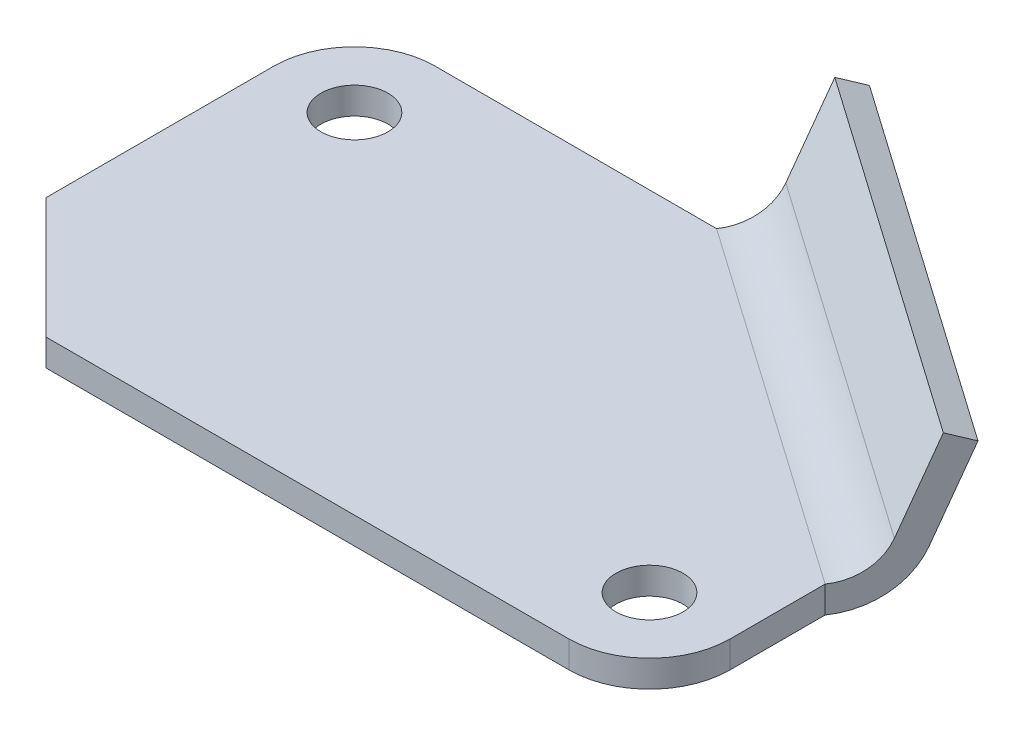
ISO-10303-21;
HEADER;
FILE_DESCRIPTION(('STEP AP214'),'2;1');
FILE_NAME('part.step','',(''),(''),'','','');
FILE_SCHEMA(('AUTOMOTIVE_DESIGN { 1 0 10303 214 1 1 1 1 }'));
ENDSEC;
DATA;
#1=APPLICATION_CONTEXT('core data for automotive mechanical design processes');
#2=APPLICATION_PROTOCOL_DEFINITION('international standard','automotive_design',2000,#1);
#3=PRODUCT_CONTEXT('',#1,'mechanical');
#4=PRODUCT('Part','Part','',(#3));
#5=PRODUCT_RELATED_PRODUCT_CATEGORY('part','',(#4));
#6=PRODUCT_DEFINITION_FORMATION('','',#4);
#7=PRODUCT_DEFINITION_CONTEXT('part definition',#1,'design');
#8=PRODUCT_DEFINITION('design','',#6,#7);
#9=PRODUCT_DEFINITION_SHAPE('','',#8);
#10=(LENGTH_UNIT() NAMED_UNIT(*) SI_UNIT(.MILLI.,.METRE.));
#11=(NAMED_UNIT(*) PLANE_ANGLE_UNIT() SI_UNIT($,.RADIAN.));
#12=(NAMED_UNIT(*) SI_UNIT($,.STERADIAN.) SOLID_ANGLE_UNIT());
#13=UNCERTAINTY_MEASURE_WITH_UNIT(LENGTH_MEASURE(1.E-05),#10,'distance_accuracy_value','');
#14=(GEOMETRIC_REPRESENTATION_CONTEXT(3) GLOBAL_UNCERTAINTY_ASSIGNED_CONTEXT((#13)) GLOBAL_UNIT_ASSIGNED_CONTEXT((#10,
#11,#12)) REPRESENTATION_CONTEXT('',''));
#15=CARTESIAN_POINT('',(0.,0.,0.));
#16=DIRECTION('',(0.,0.,1.));
#17=DIRECTION('',(1.,0.,0.));
#18=AXIS2_PLACEMENT_3D('',#15,#16,#17);
#19=CARTESIAN_POINT('',(12.,4.,-52.));
#20=DIRECTION('',(0.,-1.,0.));
#21=DIRECTION('',(0.,0.,-1.));
#22=AXIS2_PLACEMENT_3D('',#19,#20,#21);
#23=CYLINDRICAL_SURFACE('',#22,12.);
#24=CARTESIAN_POINT('',(12.,0.,-52.));
#25=DIRECTION('',(0.,1.,0.));
#26=DIRECTION('',(0.,0.,1.));
#27=AXIS2_PLACEMENT_3D('',#24,#25,#26);
#28=CIRCLE('',#27,12.);
#29=CARTESIAN_POINT('',(0.,0.,-51.9999999999999));
#30=VERTEX_POINT('',#29);
#31=CARTESIAN_POINT('',(12.0000000000001,0.,-64.));
#32=VERTEX_POINT('',#31);
#33=EDGE_CURVE('E144',#30,#32,#28,.F.);
#34=ORIENTED_EDGE('',*,*,#33,.F.);
#35=DIRECTION('',(0.,-1.,0.));
#36=VECTOR('',#35,1.);
#37=CARTESIAN_POINT('',(0.,4.,-51.9999999999999));
#38=LINE('',#37,#36);
#39=CARTESIAN_POINT('',(0.,4.,-51.9999999999999));
#40=VERTEX_POINT('',#39);
#41=EDGE_CURVE('E11',#40,#30,#38,.T.);
#42=ORIENTED_EDGE('',*,*,#41,.F.);
#43=CARTESIAN_POINT('',(12.,4.,-52.));
#44=DIRECTION('',(0.,1.,0.));
#45=DIRECTION('',(0.,0.,1.));
#46=AXIS2_PLACEMENT_3D('',#43,#44,#45);
#47=CIRCLE('',#46,12.);
#48=CARTESIAN_POINT('',(12.0000000000001,4.,-64.));
#49=VERTEX_POINT('',#48);
#50=EDGE_CURVE('E170',#40,#49,#47,.F.);
#51=ORIENTED_EDGE('',*,*,#50,.T.);
#52=DIRECTION('',(0.,-1.,0.));
#53=VECTOR('',#52,1.);
#54=CARTESIAN_POINT('',(12.0000000000001,4.,-64.));
#55=LINE('',#54,#53);
#56=EDGE_CURVE('E52',#49,#32,#55,.T.);
#57=ORIENTED_EDGE('',*,*,#56,.T.);
#58=EDGE_LOOP('',(#34,#42,#51,#57));
#59=FACE_BOUND('',#58,.T.);
#60=ADVANCED_FACE('F36',(#59),#23,.T.);
#61=CARTESIAN_POINT('',(0.,4.,0.));
#62=DIRECTION('',(-1.,0.,0.));
#63=DIRECTION('',(0.,0.,1.));
#64=AXIS2_PLACEMENT_3D('',#61,#62,#63);
#65=PLANE('',#64);
#66=DIRECTION('',(0.,0.,-1.));
#67=VECTOR('',#66,1.);
#68=CARTESIAN_POINT('',(0.,0.,0.));
#69=LINE('',#68,#67);
#70=CARTESIAN_POINT('',(0.,0.,-18.));
#71=VERTEX_POINT('',#70);
#72=EDGE_CURVE('E146',#71,#30,#69,.T.);
#73=ORIENTED_EDGE('',*,*,#72,.F.);
#74=DIRECTION('',(0.,-1.,0.));
#75=VECTOR('',#74,1.);
#76=CARTESIAN_POINT('',(0.,4.,-18.));
#77=LINE('',#76,#75);
#78=CARTESIAN_POINT('',(0.,4.,-18.));
#79=VERTEX_POINT('',#78);
#80=EDGE_CURVE('E44',#79,#71,#77,.T.);
#81=ORIENTED_EDGE('',*,*,#80,.F.);
#82=DIRECTION('',(0.,0.,-1.));
#83=VECTOR('',#82,1.);
#84=CARTESIAN_POINT('',(0.,4.,0.));
#85=LINE('',#84,#83);
#86=EDGE_CURVE('E187',#79,#40,#85,.T.);
#87=ORIENTED_EDGE('',*,*,#86,.T.);
#88=ORIENTED_EDGE('',*,*,#41,.T.);
#89=EDGE_LOOP('',(#73,#81,#87,#88));
#90=FACE_BOUND('',#89,.T.);
#91=ADVANCED_FACE('F186',(#90),#65,.T.);
#92=CARTESIAN_POINT('',(9.,4.,-9.));
#93=DIRECTION('',(0.707106781186547,0.,-0.707106781186548));
#94=DIRECTION('',(-0.707106781186548,0.,-0.707106781186547));
#95=AXIS2_PLACEMENT_3D('',#92,#93,#94);
#96=PLANE('',#95);
#97=DIRECTION('',(0.707106781186548,0.,0.707106781186547));
#98=VECTOR('',#97,1.);
#99=CARTESIAN_POINT('',(9.,0.,-9.));
#100=LINE('',#99,#98);
#101=CARTESIAN_POINT('',(18.,0.,0.));
#102=VERTEX_POINT('',#101);
#103=EDGE_CURVE('E150',#71,#102,#100,.T.);
#104=ORIENTED_EDGE('',*,*,#103,.T.);
#105=DIRECTION('',(0.,-1.,0.));
#106=VECTOR('',#105,1.);
#107=CARTESIAN_POINT('',(18.,4.,0.));
#108=LINE('',#107,#106);
#109=CARTESIAN_POINT('',(18.,4.,0.));
#110=VERTEX_POINT('',#109);
#111=EDGE_CURVE('E122',#110,#102,#108,.T.);
#112=ORIENTED_EDGE('',*,*,#111,.F.);
#113=DIRECTION('',(0.707106781186548,0.,0.707106781186547));
#114=VECTOR('',#113,1.);
#115=CARTESIAN_POINT('',(9.,4.,-9.));
#116=LINE('',#115,#114);
#117=EDGE_CURVE('E110',#79,#110,#116,.T.);
#118=ORIENTED_EDGE('',*,*,#117,.F.);
#119=ORIENTED_EDGE('',*,*,#80,.T.);
#120=EDGE_LOOP('',(#104,#112,#118,#119));
#121=FACE_BOUND('',#120,.T.);
#122=ADVANCED_FACE('F179',(#121),#96,.F.);
#123=CARTESIAN_POINT('',(0.,4.,0.));
#124=DIRECTION('',(0.,0.,-1.));
#125=DIRECTION('',(-1.,0.,0.));
#126=AXIS2_PLACEMENT_3D('',#123,#124,#125);
#127=PLANE('',#126);
#128=DIRECTION('',(1.,0.,0.));
#129=VECTOR('',#128,1.);
#130=CARTESIAN_POINT('',(0.,0.,0.));
#131=LINE('',#130,#129);
#132=CARTESIAN_POINT('',(95.9999999999999,0.,0.));
#133=VERTEX_POINT('',#132);
#134=EDGE_CURVE('E119',#102,#133,#131,.T.);
#135=ORIENTED_EDGE('',*,*,#134,.T.);
#136=DIRECTION('',(0.,-1.,0.));
#137=VECTOR('',#136,1.);
#138=CARTESIAN_POINT('',(95.9999999999999,4.,0.));
#139=LINE('',#138,#137);
#140=CARTESIAN_POINT('',(95.9999999999999,4.,0.));
#141=VERTEX_POINT('',#140);
#142=EDGE_CURVE('E116',#141,#133,#139,.T.);
#143=ORIENTED_EDGE('',*,*,#142,.F.);
#144=DIRECTION('',(1.,0.,0.));
#145=VECTOR('',#144,1.);
#146=CARTESIAN_POINT('',(0.,4.,0.));
#147=LINE('',#146,#145);
#148=EDGE_CURVE('E100',#110,#141,#147,.T.);
#149=ORIENTED_EDGE('',*,*,#148,.F.);
#150=ORIENTED_EDGE('',*,*,#111,.T.);
#151=EDGE_LOOP('',(#135,#143,#149,#150));
#152=FACE_BOUND('',#151,.T.);
#153=ADVANCED_FACE('F117',(#152),#127,.F.);
#154=CARTESIAN_POINT('',(96.,4.,-12.));
#155=DIRECTION('',(0.,-1.,0.));
#156=DIRECTION('',(0.,0.,-1.));
#157=AXIS2_PLACEMENT_3D('',#154,#155,#156);
#158=CYLINDRICAL_SURFACE('',#157,12.);
#159=CARTESIAN_POINT('',(96.,0.,-12.));
#160=DIRECTION('',(0.,1.,0.));
#161=DIRECTION('',(0.,0.,1.));
#162=AXIS2_PLACEMENT_3D('',#159,#160,#161);
#163=CIRCLE('',#162,12.);
#164=CARTESIAN_POINT('',(108.,0.,-12.0000000000001));
#165=VERTEX_POINT('',#164);
#166=EDGE_CURVE('E153',#133,#165,#163,.T.);
#167=ORIENTED_EDGE('',*,*,#166,.T.);
#168=DIRECTION('',(0.,-1.,0.));
#169=VECTOR('',#168,1.);
#170=CARTESIAN_POINT('',(108.,4.,-12.0000000000001));
#171=LINE('',#170,#169);
#172=CARTESIAN_POINT('',(108.,4.,-12.0000000000001));
#173=VERTEX_POINT('',#172);
#174=EDGE_CURVE('E123',#173,#165,#171,.T.);
#175=ORIENTED_EDGE('',*,*,#174,.F.);
#176=CARTESIAN_POINT('',(96.,4.,-12.));
#177=DIRECTION('',(0.,1.,0.));
#178=DIRECTION('',(0.,0.,1.));
#179=AXIS2_PLACEMENT_3D('',#176,#177,#178);
#180=CIRCLE('',#179,12.);
#181=EDGE_CURVE('E106',#141,#173,#180,.T.);
#182=ORIENTED_EDGE('',*,*,#181,.F.);
#183=ORIENTED_EDGE('',*,*,#142,.T.);
#184=EDGE_LOOP('',(#167,#175,#182,#183));
#185=FACE_BOUND('',#184,.T.);
#186=ADVANCED_FACE('F125',(#185),#158,.T.);
#187=CARTESIAN_POINT('',(108.,4.,0.));
#188=DIRECTION('',(-1.,0.,0.));
#189=DIRECTION('',(0.,0.,1.));
#190=AXIS2_PLACEMENT_3D('',#187,#188,#189);
#191=PLANE('',#190);
#192=DIRECTION('',(0.,0.,-1.));
#193=VECTOR('',#192,1.);
#194=CARTESIAN_POINT('',(108.,0.,0.));
#195=LINE('',#194,#193);
#196=CARTESIAN_POINT('',(108.,0.,-26.1887929366756));
#197=VERTEX_POINT('',#196);
#198=EDGE_CURVE('E155',#165,#197,#195,.T.);
#199=ORIENTED_EDGE('',*,*,#198,.T.);
#200=DIRECTION('',(0.,-1.,0.));
#201=VECTOR('',#200,1.);
#202=CARTESIAN_POINT('',(108.,4.,-26.1887929366756));
#203=LINE('',#202,#201);
#204=CARTESIAN_POINT('',(108.,4.,-26.1887929366756));
#205=VERTEX_POINT('',#204);
#206=EDGE_CURVE('E79',#205,#197,#203,.T.);
#207=ORIENTED_EDGE('',*,*,#206,.F.);
#208=DIRECTION('',(0.,0.,-1.));
#209=VECTOR('',#208,1.);
#210=CARTESIAN_POINT('',(108.,4.,0.));
#211=LINE('',#210,#209);
#212=EDGE_CURVE('E128',#173,#205,#211,.T.);
#213=ORIENTED_EDGE('',*,*,#212,.F.);
#214=ORIENTED_EDGE('',*,*,#174,.T.);
#215=EDGE_LOOP('',(#199,#207,#213,#214));
#216=FACE_BOUND('',#215,.T.);
#217=ADVANCED_FACE('F220',(#216),#191,.F.);
#218=CARTESIAN_POINT('',(96.,4.,-12.));
#219=DIRECTION('',(0.,-1.,0.));
#220=DIRECTION('',(0.,0.,-1.));
#221=AXIS2_PLACEMENT_3D('',#218,#219,#220);
#222=CYLINDRICAL_SURFACE('',#221,5.);
#223=CARTESIAN_POINT('',(96.,4.,-12.));
#224=DIRECTION('',(0.,1.,0.));
#225=DIRECTION('',(0.,0.,1.));
#226=AXIS2_PLACEMENT_3D('',#223,#224,#225);
#227=CIRCLE('',#226,5.);
#228=CARTESIAN_POINT('',(96.,4.,-6.99999999999999));
#229=VERTEX_POINT('',#228);
#230=EDGE_CURVE('E138',#229,#229,#227,.T.);
#231=ORIENTED_EDGE('',*,*,#230,.T.);
#232=EDGE_LOOP('',(#231));
#233=FACE_BOUND('',#232,.T.);
#234=CARTESIAN_POINT('',(96.,0.,-12.));
#235=DIRECTION('',(0.,1.,0.));
#236=DIRECTION('',(0.,0.,1.));
#237=AXIS2_PLACEMENT_3D('',#234,#235,#236);
#238=CIRCLE('',#237,5.);
#239=CARTESIAN_POINT('',(96.,0.,-6.99999999999999));
#240=VERTEX_POINT('',#239);
#241=EDGE_CURVE('E164',#240,#240,#238,.T.);
#242=ORIENTED_EDGE('',*,*,#241,.F.);
#243=EDGE_LOOP('',(#242));
#244=FACE_BOUND('',#243,.T.);
#245=ADVANCED_FACE('F304',(#233,#244),#222,.F.);
#246=CARTESIAN_POINT('',(0.,4.,-64.));
#247=DIRECTION('',(0.,0.,-1.));
#248=DIRECTION('',(-1.,0.,0.));
#249=AXIS2_PLACEMENT_3D('',#246,#247,#248);
#250=PLANE('',#249);
#251=DIRECTION('',(1.,0.,0.));
#252=VECTOR('',#251,1.);
#253=CARTESIAN_POINT('',(0.,0.,-64.));
#254=LINE('',#253,#252);
#255=CARTESIAN_POINT('',(54.,0.,-64.));
#256=VERTEX_POINT('',#255);
#257=EDGE_CURVE('E161',#32,#256,#254,.T.);
#258=ORIENTED_EDGE('',*,*,#257,.F.);
#259=ORIENTED_EDGE('',*,*,#56,.F.);
#260=DIRECTION('',(1.,0.,0.));
#261=VECTOR('',#260,1.);
#262=CARTESIAN_POINT('',(0.,4.,-64.));
#263=LINE('',#262,#261);
#264=CARTESIAN_POINT('',(54.,4.,-64.));
#265=VERTEX_POINT('',#264);
#266=EDGE_CURVE('E136',#49,#265,#263,.T.);
#267=ORIENTED_EDGE('',*,*,#266,.T.);
#268=DIRECTION('',(0.,-1.,0.));
#269=VECTOR('',#268,1.);
#270=CARTESIAN_POINT('',(54.,4.,-64.));
#271=LINE('',#270,#269);
#272=EDGE_CURVE('E172',#265,#256,#271,.T.);
#273=ORIENTED_EDGE('',*,*,#272,.T.);
#274=EDGE_LOOP('',(#258,#259,#267,#273));
#275=FACE_BOUND('',#274,.T.);
#276=ADVANCED_FACE('F189',(#275),#250,.T.);
#277=CARTESIAN_POINT('',(12.,4.,-52.));
#278=DIRECTION('',(0.,-1.,0.));
#279=DIRECTION('',(0.,0.,-1.));
#280=AXIS2_PLACEMENT_3D('',#277,#278,#279);
#281=CYLINDRICAL_SURFACE('',#280,5.);
#282=CARTESIAN_POINT('',(12.,4.,-52.));
#283=DIRECTION('',(0.,1.,0.));
#284=DIRECTION('',(0.,0.,1.));
#285=AXIS2_PLACEMENT_3D('',#282,#283,#284);
#286=CIRCLE('',#285,5.);
#287=CARTESIAN_POINT('',(12.,4.,-47.));
#288=VERTEX_POINT('',#287);
#289=EDGE_CURVE('E141',#288,#288,#286,.T.);
#290=ORIENTED_EDGE('',*,*,#289,.T.);
#291=EDGE_LOOP('',(#290));
#292=FACE_BOUND('',#291,.T.);
#293=CARTESIAN_POINT('',(12.,0.,-52.));
#294=DIRECTION('',(0.,1.,0.));
#295=DIRECTION('',(0.,0.,1.));
#296=AXIS2_PLACEMENT_3D('',#293,#294,#295);
#297=CIRCLE('',#296,5.);
#298=CARTESIAN_POINT('',(12.,0.,-47.));
#299=VERTEX_POINT('',#298);
#300=EDGE_CURVE('E167',#299,#299,#297,.T.);
#301=ORIENTED_EDGE('',*,*,#300,.F.);
#302=EDGE_LOOP('',(#301));
#303=FACE_BOUND('',#302,.T.);
#304=ADVANCED_FACE('F307',(#292,#303),#281,.F.);
#305=CARTESIAN_POINT('',(0.,4.,0.));
#306=DIRECTION('',(0.,1.,0.));
#307=DIRECTION('',(0.,0.,1.));
#308=AXIS2_PLACEMENT_3D('',#305,#306,#307);
#309=PLANE('',#308);
#310=ORIENTED_EDGE('',*,*,#50,.F.);
#311=ORIENTED_EDGE('',*,*,#86,.F.);
#312=ORIENTED_EDGE('',*,*,#117,.T.);
#313=ORIENTED_EDGE('',*,*,#148,.T.);
#314=ORIENTED_EDGE('',*,*,#181,.T.);
#315=ORIENTED_EDGE('',*,*,#212,.T.);
#316=DIRECTION('',(0.819152044288991,0.,0.573576436351047));
#317=VECTOR('',#316,1.);
#318=CARTESIAN_POINT('',(47.8356199953561,4.,-68.3163453476409));
#319=LINE('',#318,#317);
#320=EDGE_CURVE('E130',#265,#205,#319,.T.);
#321=ORIENTED_EDGE('',*,*,#320,.F.);
#322=ORIENTED_EDGE('',*,*,#266,.F.);
#323=EDGE_LOOP('',(#310,#311,#312,#313,#314,#315,#321,#322));
#324=FACE_BOUND('',#323,.T.);
#325=ORIENTED_EDGE('',*,*,#230,.F.);
#326=EDGE_LOOP('',(#325));
#327=FACE_BOUND('',#326,.T.);
#328=ORIENTED_EDGE('',*,*,#289,.F.);
#329=EDGE_LOOP('',(#328));
#330=FACE_BOUND('',#329,.T.);
#331=ADVANCED_FACE('F102',(#324,#327,#330),#309,.T.);
#332=CARTESIAN_POINT('',(0.,0.,0.));
#333=DIRECTION('',(0.,1.,0.));
#334=DIRECTION('',(0.,0.,1.));
#335=AXIS2_PLACEMENT_3D('',#332,#333,#334);
#336=PLANE('',#335);
#337=ORIENTED_EDGE('',*,*,#33,.T.);
#338=ORIENTED_EDGE('',*,*,#257,.T.);
#339=DIRECTION('',(0.819152044288991,0.,0.573576436351047));
#340=VECTOR('',#339,1.);
#341=CARTESIAN_POINT('',(47.8356199953561,0.,-68.3163453476409));
#342=LINE('',#341,#340);
#343=EDGE_CURVE('E158',#256,#197,#342,.T.);
#344=ORIENTED_EDGE('',*,*,#343,.T.);
#345=ORIENTED_EDGE('',*,*,#198,.F.);
#346=ORIENTED_EDGE('',*,*,#166,.F.);
#347=ORIENTED_EDGE('',*,*,#134,.F.);
#348=ORIENTED_EDGE('',*,*,#103,.F.);
#349=ORIENTED_EDGE('',*,*,#72,.T.);
#350=EDGE_LOOP('',(#337,#338,#344,#345,#346,#347,#348,#349));
#351=FACE_BOUND('',#350,.T.);
#352=ORIENTED_EDGE('',*,*,#241,.T.);
#353=EDGE_LOOP('',(#352));
#354=FACE_BOUND('',#353,.T.);
#355=ORIENTED_EDGE('',*,*,#300,.T.);
#356=EDGE_LOOP('',(#355));
#357=FACE_BOUND('',#356,.T.);
#358=ADVANCED_FACE('F184',(#351,#354,#357),#336,.F.);
#359=CARTESIAN_POINT('',(54.,12.,-64.));
#360=DIRECTION('',(0.819152044288991,0.,0.573576436351047));
#361=DIRECTION('',(0.573576436351047,0.,-0.819152044288991));
#362=AXIS2_PLACEMENT_3D('',#359,#360,#361);
#363=CYLINDRICAL_SURFACE('',#362,7.99999999999999);
#364=CARTESIAN_POINT('',(108.,12.,-26.1887929366756));
#365=DIRECTION('',(-0.819152044288991,0.,-0.573576436351047));
#366=DIRECTION('',(0.573576436351047,0.,-0.819152044288991));
#367=AXIS2_PLACEMENT_3D('',#364,#365,#366);
#368=CIRCLE('',#367,7.99999999999999);
#369=CARTESIAN_POINT('',(112.254486489157,9.00314725267273,-32.2648293358766));
#370=VERTEX_POINT('',#369);
#371=EDGE_CURVE('E231',#370,#205,#368,.T.);
#372=ORIENTED_EDGE('',*,*,#371,.F.);
#373=DIRECTION('',(0.819152044288991,0.,0.573576436351047));
#374=VECTOR('',#373,1.);
#375=CARTESIAN_POINT('',(58.2544864891572,9.00314725267273,-70.0760363992011));
#376=LINE('',#375,#374);
#377=CARTESIAN_POINT('',(58.2544864891572,9.00314725267273,-70.0760363992011));
#378=VERTEX_POINT('',#377);
#379=EDGE_CURVE('E147',#378,#370,#376,.T.);
#380=ORIENTED_EDGE('',*,*,#379,.F.);
#381=CARTESIAN_POINT('',(54.,12.,-64.));
#382=DIRECTION('',(-0.819152044288991,0.,-0.573576436351047));
#383=DIRECTION('',(0.573576436351047,0.,-0.819152044288991));
#384=AXIS2_PLACEMENT_3D('',#381,#382,#383);
#385=CIRCLE('',#384,7.99999999999999);
#386=EDGE_CURVE('E202',#378,#265,#385,.T.);
#387=ORIENTED_EDGE('',*,*,#386,.T.);
#388=ORIENTED_EDGE('',*,*,#320,.T.);
#389=EDGE_LOOP('',(#372,#380,#387,#388));
#390=FACE_BOUND('',#389,.T.);
#391=ADVANCED_FACE('F212',(#390),#363,.F.);
#392=CARTESIAN_POINT('',(58.2544864891572,9.00314725267273,-70.0760363992011));
#393=DIRECTION('',(-0.531810811144646,0.37460659341591,0.759504549900131));
#394=DIRECTION('',(0.819152044288991,0.,0.573576436351047));
#395=AXIS2_PLACEMENT_3D('',#392,#393,#394);
#396=PLANE('',#395);
#397=DIRECTION('',(-0.214865514885103,-0.927183854566788,0.306859756800777));
#398=VECTOR('',#397,1.);
#399=CARTESIAN_POINT('',(112.254486489157,9.00314725267273,-32.2648293358766));
#400=LINE('',#399,#398);
#401=CARTESIAN_POINT('',(115.262603697549,21.9837212166078,-36.5608659310875));
#402=VERTEX_POINT('',#401);
#403=EDGE_CURVE('E215',#402,#370,#400,.T.);
#404=ORIENTED_EDGE('',*,*,#403,.F.);
#405=DIRECTION('',(0.819152044288991,0.,0.573576436351047));
#406=VECTOR('',#405,1.);
#407=CARTESIAN_POINT('',(61.2626036975486,21.9837212166078,-74.3720729944119));
#408=LINE('',#407,#406);
#409=CARTESIAN_POINT('',(61.2626036975486,21.9837212166078,-74.3720729944119));
#410=VERTEX_POINT('',#409);
#411=EDGE_CURVE('E243',#410,#402,#408,.T.);
#412=ORIENTED_EDGE('',*,*,#411,.F.);
#413=DIRECTION('',(-0.214865514885103,-0.927183854566788,0.306859756800777));
#414=VECTOR('',#413,1.);
#415=CARTESIAN_POINT('',(58.2544864891572,9.00314725267273,-70.0760363992011));
#416=LINE('',#415,#414);
#417=EDGE_CURVE('E250',#410,#378,#416,.T.);
#418=ORIENTED_EDGE('',*,*,#417,.T.);
#419=ORIENTED_EDGE('',*,*,#379,.T.);
#420=EDGE_LOOP('',(#404,#412,#418,#419));
#421=FACE_BOUND('',#420,.T.);
#422=ADVANCED_FACE('F278',(#421),#396,.T.);
#423=CARTESIAN_POINT('',(61.2626036975486,21.9837212166078,-74.3720729944119));
#424=DIRECTION('',(0.214865514885103,0.927183854566788,-0.306859756800778));
#425=DIRECTION('',(0.,0.314198283252712,0.949357382022728));
#426=AXIS2_PLACEMENT_3D('',#423,#424,#425);
#427=PLANE('',#426);
#428=DIRECTION('',(-0.531810811144646,0.37460659341591,0.759504549900131));
#429=VECTOR('',#428,1.);
#430=CARTESIAN_POINT('',(115.262603697549,21.9837212166078,-36.5608659310875));
#431=LINE('',#430,#429);
#432=CARTESIAN_POINT('',(117.389846942127,20.4852948429441,-39.598884130688));
#433=VERTEX_POINT('',#432);
#434=EDGE_CURVE('E233',#433,#402,#431,.T.);
#435=ORIENTED_EDGE('',*,*,#434,.F.);
#436=DIRECTION('',(0.819152044288991,0.,0.573576436351047));
#437=VECTOR('',#436,1.);
#438=CARTESIAN_POINT('',(63.3898469421272,20.4852948429441,-77.4100911940125));
#439=LINE('',#438,#437);
#440=CARTESIAN_POINT('',(63.3898469421272,20.4852948429441,-77.4100911940125));
#441=VERTEX_POINT('',#440);
#442=EDGE_CURVE('E246',#441,#433,#439,.T.);
#443=ORIENTED_EDGE('',*,*,#442,.F.);
#444=DIRECTION('',(-0.531810811144646,0.37460659341591,0.759504549900131));
#445=VECTOR('',#444,1.);
#446=CARTESIAN_POINT('',(61.2626036975486,21.9837212166078,-74.3720729944119));
#447=LINE('',#446,#445);
#448=EDGE_CURVE('E252',#441,#410,#447,.T.);
#449=ORIENTED_EDGE('',*,*,#448,.T.);
#450=ORIENTED_EDGE('',*,*,#411,.T.);
#451=EDGE_LOOP('',(#435,#443,#449,#450));
#452=FACE_BOUND('',#451,.T.);
#453=ADVANCED_FACE('F280',(#452),#427,.T.);
#454=CARTESIAN_POINT('',(63.3898469421272,20.4852948429441,-77.4100911940125));
#455=DIRECTION('',(0.531810811144647,-0.374606593415908,-0.759504549900132));
#456=DIRECTION('',(-0.819152044288991,0.,-0.573576436351047));
#457=AXIS2_PLACEMENT_3D('',#454,#455,#456);
#458=PLANE('',#457);
#459=DIRECTION('',(0.214865514885102,0.927183854566789,-0.306859756800776));
#460=VECTOR('',#459,1.);
#461=CARTESIAN_POINT('',(117.389846942127,20.4852948429441,-39.598884130688));
#462=LINE('',#461,#460);
#463=CARTESIAN_POINT('',(114.381729733736,7.50472087900909,-35.3028475354771));
#464=VERTEX_POINT('',#463);
#465=EDGE_CURVE('E230',#464,#433,#462,.T.);
#466=ORIENTED_EDGE('',*,*,#465,.F.);
#467=DIRECTION('',(0.819152044288991,0.,0.573576436351047));
#468=VECTOR('',#467,1.);
#469=CARTESIAN_POINT('',(60.3817297337357,7.50472087900909,-73.1140545988016));
#470=LINE('',#469,#468);
#471=CARTESIAN_POINT('',(60.3817297337357,7.50472087900909,-73.1140545988016));
#472=VERTEX_POINT('',#471);
#473=EDGE_CURVE('E227',#472,#464,#470,.T.);
#474=ORIENTED_EDGE('',*,*,#473,.F.);
#475=DIRECTION('',(0.214865514885102,0.927183854566789,-0.306859756800776));
#476=VECTOR('',#475,1.);
#477=CARTESIAN_POINT('',(63.3898469421272,20.4852948429441,-77.4100911940125));
#478=LINE('',#477,#476);
#479=EDGE_CURVE('E256',#472,#441,#478,.T.);
#480=ORIENTED_EDGE('',*,*,#479,.T.);
#481=ORIENTED_EDGE('',*,*,#442,.T.);
#482=EDGE_LOOP('',(#466,#474,#480,#481));
#483=FACE_BOUND('',#482,.T.);
#484=ADVANCED_FACE('F263',(#483),#458,.T.);
#485=CARTESIAN_POINT('',(54.,12.,-64.));
#486=DIRECTION('',(0.819152044288991,0.,0.573576436351047));
#487=DIRECTION('',(0.573576436351047,0.,-0.819152044288991));
#488=AXIS2_PLACEMENT_3D('',#485,#486,#487);
#489=CYLINDRICAL_SURFACE('',#488,12.);
#490=CARTESIAN_POINT('',(108.,12.,-26.1887929366756));
#491=DIRECTION('',(0.819152044288991,0.,0.573576436351047));
#492=DIRECTION('',(-0.573576436351047,0.,0.819152044288991));
#493=AXIS2_PLACEMENT_3D('',#490,#491,#492);
#494=CIRCLE('',#493,12.);
#495=EDGE_CURVE('E225',#197,#464,#494,.T.);
#496=ORIENTED_EDGE('',*,*,#495,.F.);
#497=ORIENTED_EDGE('',*,*,#343,.F.);
#498=CARTESIAN_POINT('',(54.,12.,-64.));
#499=DIRECTION('',(0.819152044288991,0.,0.573576436351047));
#500=DIRECTION('',(-0.573576436351047,0.,0.819152044288991));
#501=AXIS2_PLACEMENT_3D('',#498,#499,#500);
#502=CIRCLE('',#501,12.);
#503=EDGE_CURVE('E206',#256,#472,#502,.T.);
#504=ORIENTED_EDGE('',*,*,#503,.T.);
#505=ORIENTED_EDGE('',*,*,#473,.T.);
#506=EDGE_LOOP('',(#496,#497,#504,#505));
#507=FACE_BOUND('',#506,.T.);
#508=ADVANCED_FACE('F223',(#507),#489,.T.);
#509=CARTESIAN_POINT('',(54.,12.,-64.));
#510=DIRECTION('',(0.819152044288991,0.,0.573576436351047));
#511=DIRECTION('',(0.573576436351047,0.,-0.819152044288991));
#512=AXIS2_PLACEMENT_3D('',#509,#510,#511);
#513=PLANE('',#512);
#514=ORIENTED_EDGE('',*,*,#386,.F.);
#515=ORIENTED_EDGE('',*,*,#417,.F.);
#516=ORIENTED_EDGE('',*,*,#448,.F.);
#517=ORIENTED_EDGE('',*,*,#479,.F.);
#518=ORIENTED_EDGE('',*,*,#503,.F.);
#519=ORIENTED_EDGE('',*,*,#272,.F.);
#520=EDGE_LOOP('',(#514,#515,#516,#517,#518,#519));
#521=FACE_BOUND('',#520,.T.);
#522=ADVANCED_FACE('F200',(#521),#513,.F.);
#523=CARTESIAN_POINT('',(108.,12.,-26.1887929366756));
#524=DIRECTION('',(0.819152044288991,0.,0.573576436351047));
#525=DIRECTION('',(0.573576436351047,0.,-0.819152044288991));
#526=AXIS2_PLACEMENT_3D('',#523,#524,#525);
#527=PLANE('',#526);
#528=ORIENTED_EDGE('',*,*,#371,.T.);
#529=ORIENTED_EDGE('',*,*,#206,.T.);
#530=ORIENTED_EDGE('',*,*,#495,.T.);
#531=ORIENTED_EDGE('',*,*,#465,.T.);
#532=ORIENTED_EDGE('',*,*,#434,.T.);
#533=ORIENTED_EDGE('',*,*,#403,.T.);
#534=EDGE_LOOP('',(#528,#529,#530,#531,#532,#533));
#535=FACE_BOUND('',#534,.T.);
#536=ADVANCED_FACE('F279',(#535),#527,.T.);
#537=CLOSED_SHELL('',(#60,#91,#122,#153,#186,#217,#245,#276,#304,#331,#358,#391,#422,#453,#484,
#508,#522,#536));
#538=MANIFOLD_SOLID_BREP('B2',#537);
#539=ADVANCED_BREP_SHAPE_REPRESENTATION('',(#18,#538),#14);
#540=SHAPE_DEFINITION_REPRESENTATION(#9,#539);
ENDSEC;
END-ISO-10303-21;
